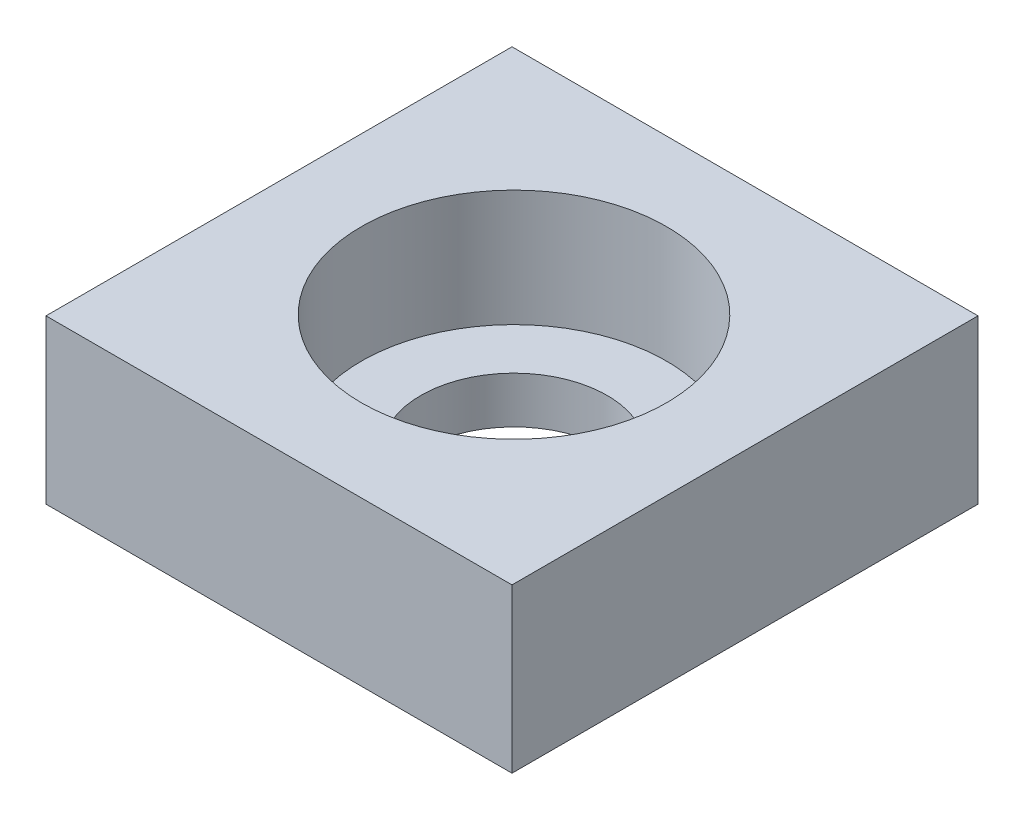
ISO-10303-21;
HEADER;
FILE_DESCRIPTION(('STEP AP214'),'2;1');
FILE_NAME('part.step','',(''),(''),'','','');
FILE_SCHEMA(('AUTOMOTIVE_DESIGN { 1 0 10303 214 1 1 1 1 }'));
ENDSEC;
DATA;
#1=APPLICATION_CONTEXT('core data for automotive mechanical design processes');
#2=APPLICATION_PROTOCOL_DEFINITION('international standard','automotive_design',2000,#1);
#3=PRODUCT_CONTEXT('',#1,'mechanical');
#4=PRODUCT('Part','Part','',(#3));
#5=PRODUCT_RELATED_PRODUCT_CATEGORY('part','',(#4));
#6=PRODUCT_DEFINITION_FORMATION('','',#4);
#7=PRODUCT_DEFINITION_CONTEXT('part definition',#1,'design');
#8=PRODUCT_DEFINITION('design','',#6,#7);
#9=PRODUCT_DEFINITION_SHAPE('','',#8);
#10=(LENGTH_UNIT() NAMED_UNIT(*) SI_UNIT(.MILLI.,.METRE.));
#11=(NAMED_UNIT(*) PLANE_ANGLE_UNIT() SI_UNIT($,.RADIAN.));
#12=(NAMED_UNIT(*) SI_UNIT($,.STERADIAN.) SOLID_ANGLE_UNIT());
#13=UNCERTAINTY_MEASURE_WITH_UNIT(LENGTH_MEASURE(1.E-05),#10,'distance_accuracy_value','');
#14=(GEOMETRIC_REPRESENTATION_CONTEXT(3) GLOBAL_UNCERTAINTY_ASSIGNED_CONTEXT((#13)) GLOBAL_UNIT_ASSIGNED_CONTEXT((#10,
#11,#12)) REPRESENTATION_CONTEXT('',''));
#15=CARTESIAN_POINT('',(0.,0.,0.));
#16=DIRECTION('',(0.,0.,1.));
#17=DIRECTION('',(1.,0.,0.));
#18=AXIS2_PLACEMENT_3D('',#15,#16,#17);
#19=CARTESIAN_POINT('',(0.,7.,0.));
#20=DIRECTION('',(0.,0.,-1.));
#21=DIRECTION('',(-1.,0.,0.));
#22=AXIS2_PLACEMENT_3D('',#19,#20,#21);
#23=PLANE('',#22);
#24=DIRECTION('',(1.,0.,0.));
#25=VECTOR('',#24,1.);
#26=CARTESIAN_POINT('',(0.,0.,0.));
#27=LINE('',#26,#25);
#28=CARTESIAN_POINT('',(0.,0.,0.));
#29=VERTEX_POINT('',#28);
#30=CARTESIAN_POINT('',(20.,0.,0.));
#31=VERTEX_POINT('',#30);
#32=EDGE_CURVE('E96',#29,#31,#27,.T.);
#33=ORIENTED_EDGE('',*,*,#32,.T.);
#34=DIRECTION('',(0.,-1.,0.));
#35=VECTOR('',#34,1.);
#36=CARTESIAN_POINT('',(20.,7.,0.));
#37=LINE('',#36,#35);
#38=CARTESIAN_POINT('',(20.,7.,0.));
#39=VERTEX_POINT('',#38);
#40=EDGE_CURVE('E11',#39,#31,#37,.T.);
#41=ORIENTED_EDGE('',*,*,#40,.F.);
#42=DIRECTION('',(1.,0.,0.));
#43=VECTOR('',#42,1.);
#44=CARTESIAN_POINT('',(0.,7.,0.));
#45=LINE('',#44,#43);
#46=CARTESIAN_POINT('',(0.,7.,0.));
#47=VERTEX_POINT('',#46);
#48=EDGE_CURVE('E82',#47,#39,#45,.T.);
#49=ORIENTED_EDGE('',*,*,#48,.F.);
#50=DIRECTION('',(0.,-1.,0.));
#51=VECTOR('',#50,1.);
#52=CARTESIAN_POINT('',(0.,7.,0.));
#53=LINE('',#52,#51);
#54=EDGE_CURVE('E49',#47,#29,#53,.T.);
#55=ORIENTED_EDGE('',*,*,#54,.T.);
#56=EDGE_LOOP('',(#33,#41,#49,#55));
#57=FACE_BOUND('',#56,.T.);
#58=ADVANCED_FACE('F33',(#57),#23,.F.);
#59=CARTESIAN_POINT('',(20.,7.,0.));
#60=DIRECTION('',(-1.,0.,0.));
#61=DIRECTION('',(0.,0.,1.));
#62=AXIS2_PLACEMENT_3D('',#59,#60,#61);
#63=PLANE('',#62);
#64=DIRECTION('',(0.,0.,-1.));
#65=VECTOR('',#64,1.);
#66=CARTESIAN_POINT('',(20.,0.,0.));
#67=LINE('',#66,#65);
#68=CARTESIAN_POINT('',(20.,0.,-20.));
#69=VERTEX_POINT('',#68);
#70=EDGE_CURVE('E87',#31,#69,#67,.T.);
#71=ORIENTED_EDGE('',*,*,#70,.T.);
#72=DIRECTION('',(0.,-1.,0.));
#73=VECTOR('',#72,1.);
#74=CARTESIAN_POINT('',(20.,7.,-20.));
#75=LINE('',#74,#73);
#76=CARTESIAN_POINT('',(20.,7.,-20.));
#77=VERTEX_POINT('',#76);
#78=EDGE_CURVE('E41',#77,#69,#75,.T.);
#79=ORIENTED_EDGE('',*,*,#78,.F.);
#80=DIRECTION('',(0.,0.,-1.));
#81=VECTOR('',#80,1.);
#82=CARTESIAN_POINT('',(20.,7.,0.));
#83=LINE('',#82,#81);
#84=EDGE_CURVE('E74',#39,#77,#83,.T.);
#85=ORIENTED_EDGE('',*,*,#84,.F.);
#86=ORIENTED_EDGE('',*,*,#40,.T.);
#87=EDGE_LOOP('',(#71,#79,#85,#86));
#88=FACE_BOUND('',#87,.T.);
#89=ADVANCED_FACE('F86',(#88),#63,.F.);
#90=CARTESIAN_POINT('',(0.,7.,-20.));
#91=DIRECTION('',(0.,0.,-1.));
#92=DIRECTION('',(-1.,0.,0.));
#93=AXIS2_PLACEMENT_3D('',#90,#91,#92);
#94=PLANE('',#93);
#95=DIRECTION('',(1.,0.,0.));
#96=VECTOR('',#95,1.);
#97=CARTESIAN_POINT('',(0.,0.,-20.));
#98=LINE('',#97,#96);
#99=CARTESIAN_POINT('',(0.,0.,-20.));
#100=VERTEX_POINT('',#99);
#101=EDGE_CURVE('E100',#100,#69,#98,.T.);
#102=ORIENTED_EDGE('',*,*,#101,.F.);
#103=DIRECTION('',(0.,-1.,0.));
#104=VECTOR('',#103,1.);
#105=CARTESIAN_POINT('',(0.,7.,-20.));
#106=LINE('',#105,#104);
#107=CARTESIAN_POINT('',(0.,7.,-20.));
#108=VERTEX_POINT('',#107);
#109=EDGE_CURVE('E63',#108,#100,#106,.T.);
#110=ORIENTED_EDGE('',*,*,#109,.F.);
#111=DIRECTION('',(1.,0.,0.));
#112=VECTOR('',#111,1.);
#113=CARTESIAN_POINT('',(0.,7.,-20.));
#114=LINE('',#113,#112);
#115=EDGE_CURVE('E81',#108,#77,#114,.T.);
#116=ORIENTED_EDGE('',*,*,#115,.T.);
#117=ORIENTED_EDGE('',*,*,#78,.T.);
#118=EDGE_LOOP('',(#102,#110,#116,#117));
#119=FACE_BOUND('',#118,.T.);
#120=ADVANCED_FACE('F90',(#119),#94,.T.);
#121=CARTESIAN_POINT('',(0.,7.,0.));
#122=DIRECTION('',(-1.,0.,0.));
#123=DIRECTION('',(0.,0.,1.));
#124=AXIS2_PLACEMENT_3D('',#121,#122,#123);
#125=PLANE('',#124);
#126=DIRECTION('',(0.,0.,-1.));
#127=VECTOR('',#126,1.);
#128=CARTESIAN_POINT('',(0.,0.,0.));
#129=LINE('',#128,#127);
#130=EDGE_CURVE('E102',#29,#100,#129,.T.);
#131=ORIENTED_EDGE('',*,*,#130,.F.);
#132=ORIENTED_EDGE('',*,*,#54,.F.);
#133=DIRECTION('',(0.,0.,-1.));
#134=VECTOR('',#133,1.);
#135=CARTESIAN_POINT('',(0.,7.,0.));
#136=LINE('',#135,#134);
#137=EDGE_CURVE('E91',#47,#108,#136,.T.);
#138=ORIENTED_EDGE('',*,*,#137,.T.);
#139=ORIENTED_EDGE('',*,*,#109,.T.);
#140=EDGE_LOOP('',(#131,#132,#138,#139));
#141=FACE_BOUND('',#140,.T.);
#142=ADVANCED_FACE('F136',(#141),#125,.T.);
#143=CARTESIAN_POINT('',(0.,7.,0.));
#144=DIRECTION('',(0.,1.,0.));
#145=DIRECTION('',(0.,0.,1.));
#146=AXIS2_PLACEMENT_3D('',#143,#144,#145);
#147=PLANE('',#146);
#148=CARTESIAN_POINT('',(10.,7.,-10.0851888571187));
#149=DIRECTION('',(0.,1.,0.));
#150=DIRECTION('',(0.,0.,1.));
#151=AXIS2_PLACEMENT_3D('',#148,#149,#150);
#152=CIRCLE('',#151,6.55);
#153=CARTESIAN_POINT('',(10.,7.,-3.5351888571187));
#154=VERTEX_POINT('',#153);
#155=EDGE_CURVE('E108',#154,#154,#152,.T.);
#156=ORIENTED_EDGE('',*,*,#155,.F.);
#157=EDGE_LOOP('',(#156));
#158=FACE_BOUND('',#157,.T.);
#159=ORIENTED_EDGE('',*,*,#48,.T.);
#160=ORIENTED_EDGE('',*,*,#84,.T.);
#161=ORIENTED_EDGE('',*,*,#115,.F.);
#162=ORIENTED_EDGE('',*,*,#137,.F.);
#163=EDGE_LOOP('',(#159,#160,#161,#162));
#164=FACE_BOUND('',#163,.T.);
#165=ADVANCED_FACE('F78',(#158,#164),#147,.T.);
#166=CARTESIAN_POINT('',(0.,0.,0.));
#167=DIRECTION('',(0.,1.,0.));
#168=DIRECTION('',(0.,0.,1.));
#169=AXIS2_PLACEMENT_3D('',#166,#167,#168);
#170=PLANE('',#169);
#171=CARTESIAN_POINT('',(10.,0.,-10.0851888571187));
#172=DIRECTION('',(0.,1.,0.));
#173=DIRECTION('',(0.,0.,1.));
#174=AXIS2_PLACEMENT_3D('',#171,#172,#173);
#175=CIRCLE('',#174,4.);
#176=CARTESIAN_POINT('',(10.,0.,-6.0851888571187));
#177=VERTEX_POINT('',#176);
#178=EDGE_CURVE('E111',#177,#177,#175,.F.);
#179=ORIENTED_EDGE('',*,*,#178,.F.);
#180=EDGE_LOOP('',(#179));
#181=FACE_BOUND('',#180,.T.);
#182=ORIENTED_EDGE('',*,*,#32,.F.);
#183=ORIENTED_EDGE('',*,*,#130,.T.);
#184=ORIENTED_EDGE('',*,*,#101,.T.);
#185=ORIENTED_EDGE('',*,*,#70,.F.);
#186=EDGE_LOOP('',(#182,#183,#184,#185));
#187=FACE_BOUND('',#186,.T.);
#188=ADVANCED_FACE('F131',(#181,#187),#170,.F.);
#189=CARTESIAN_POINT('',(10.,2.,-10.0851888571187));
#190=DIRECTION('',(0.,1.,0.));
#191=DIRECTION('',(0.,0.,1.));
#192=AXIS2_PLACEMENT_3D('',#189,#190,#191);
#193=CYLINDRICAL_SURFACE('',#192,6.55);
#194=CARTESIAN_POINT('',(10.,2.,-10.0851888571187));
#195=DIRECTION('',(0.,1.,0.));
#196=DIRECTION('',(0.,0.,1.));
#197=AXIS2_PLACEMENT_3D('',#194,#195,#196);
#198=CIRCLE('',#197,6.55);
#199=CARTESIAN_POINT('',(10.,2.,-3.5351888571187));
#200=VERTEX_POINT('',#199);
#201=EDGE_CURVE('E98',#200,#200,#198,.T.);
#202=ORIENTED_EDGE('',*,*,#201,.F.);
#203=EDGE_LOOP('',(#202));
#204=FACE_BOUND('',#203,.T.);
#205=ORIENTED_EDGE('',*,*,#155,.T.);
#206=EDGE_LOOP('',(#205));
#207=FACE_BOUND('',#206,.T.);
#208=ADVANCED_FACE('F125',(#204,#207),#193,.F.);
#209=CARTESIAN_POINT('',(10.,2.,-10.0851888571187));
#210=DIRECTION('',(0.,1.,0.));
#211=DIRECTION('',(0.,0.,1.));
#212=AXIS2_PLACEMENT_3D('',#209,#210,#211);
#213=PLANE('',#212);
#214=CARTESIAN_POINT('',(10.,2.,-10.0851888571187));
#215=DIRECTION('',(0.,1.,0.));
#216=DIRECTION('',(0.,0.,1.));
#217=AXIS2_PLACEMENT_3D('',#214,#215,#216);
#218=CIRCLE('',#217,4.);
#219=CARTESIAN_POINT('',(10.,2.,-6.0851888571187));
#220=VERTEX_POINT('',#219);
#221=EDGE_CURVE('E116',#220,#220,#218,.T.);
#222=ORIENTED_EDGE('',*,*,#221,.F.);
#223=EDGE_LOOP('',(#222));
#224=FACE_BOUND('',#223,.T.);
#225=ORIENTED_EDGE('',*,*,#201,.T.);
#226=EDGE_LOOP('',(#225));
#227=FACE_BOUND('',#226,.T.);
#228=ADVANCED_FACE('F122',(#224,#227),#213,.T.);
#229=CARTESIAN_POINT('',(10.,-11.3137084989848,-10.0851888571187));
#230=DIRECTION('',(0.,1.,0.));
#231=DIRECTION('',(0.,0.,1.));
#232=AXIS2_PLACEMENT_3D('',#229,#230,#231);
#233=CYLINDRICAL_SURFACE('',#232,4.);
#234=CARTESIAN_POINT('',(10.,0.,-6.0851888571187));
#235=CARTESIAN_POINT('',(10.,0.0208333333333333,-6.0851888571187));
#236=CARTESIAN_POINT('',(10.,0.0416666666666667,-6.0851888571187));
#237=CARTESIAN_POINT('',(10.,0.0833333333333334,-6.0851888571187));
#238=CARTESIAN_POINT('',(10.,0.104166666666667,-6.0851888571187));
#239=CARTESIAN_POINT('',(10.,0.145833333333333,-6.0851888571187));
#240=CARTESIAN_POINT('',(10.,0.166666666666667,-6.0851888571187));
#241=CARTESIAN_POINT('',(10.,0.208333333333334,-6.0851888571187));
#242=CARTESIAN_POINT('',(10.,0.229166666666667,-6.0851888571187));
#243=CARTESIAN_POINT('',(10.,0.270833333333334,-6.0851888571187));
#244=CARTESIAN_POINT('',(10.,0.291666666666667,-6.0851888571187));
#245=CARTESIAN_POINT('',(10.,0.333333333333334,-6.0851888571187));
#246=CARTESIAN_POINT('',(10.,0.354166666666667,-6.0851888571187));
#247=CARTESIAN_POINT('',(10.,0.395833333333334,-6.0851888571187));
#248=CARTESIAN_POINT('',(10.,0.416666666666667,-6.0851888571187));
#249=CARTESIAN_POINT('',(10.,0.458333333333334,-6.0851888571187));
#250=CARTESIAN_POINT('',(10.,0.479166666666667,-6.0851888571187));
#251=CARTESIAN_POINT('',(10.,0.520833333333333,-6.0851888571187));
#252=CARTESIAN_POINT('',(10.,0.541666666666666,-6.0851888571187));
#253=CARTESIAN_POINT('',(10.,0.583333333333332,-6.0851888571187));
#254=CARTESIAN_POINT('',(10.,0.604166666666666,-6.0851888571187));
#255=CARTESIAN_POINT('',(10.,0.645833333333332,-6.0851888571187));
#256=CARTESIAN_POINT('',(10.,0.666666666666666,-6.0851888571187));
#257=CARTESIAN_POINT('',(10.,0.708333333333332,-6.0851888571187));
#258=CARTESIAN_POINT('',(10.,0.729166666666666,-6.0851888571187));
#259=CARTESIAN_POINT('',(10.,0.770833333333332,-6.0851888571187));
#260=CARTESIAN_POINT('',(10.,0.791666666666666,-6.0851888571187));
#261=CARTESIAN_POINT('',(10.,0.833333333333332,-6.0851888571187));
#262=CARTESIAN_POINT('',(10.,0.854166666666666,-6.0851888571187));
#263=CARTESIAN_POINT('',(10.,0.895833333333332,-6.0851888571187));
#264=CARTESIAN_POINT('',(10.,0.916666666666666,-6.0851888571187));
#265=CARTESIAN_POINT('',(10.,0.958333333333332,-6.0851888571187));
#266=CARTESIAN_POINT('',(10.,0.979166666666666,-6.0851888571187));
#267=CARTESIAN_POINT('',(10.,1.02083333333333,-6.0851888571187));
#268=CARTESIAN_POINT('',(10.,1.04166666666667,-6.0851888571187));
#269=CARTESIAN_POINT('',(10.,1.08333333333333,-6.0851888571187));
#270=CARTESIAN_POINT('',(10.,1.10416666666667,-6.0851888571187));
#271=CARTESIAN_POINT('',(10.,1.14583333333333,-6.0851888571187));
#272=CARTESIAN_POINT('',(10.,1.16666666666667,-6.0851888571187));
#273=CARTESIAN_POINT('',(10.,1.20833333333333,-6.0851888571187));
#274=CARTESIAN_POINT('',(10.,1.22916666666667,-6.0851888571187));
#275=CARTESIAN_POINT('',(10.,1.27083333333333,-6.0851888571187));
#276=CARTESIAN_POINT('',(10.,1.29166666666667,-6.0851888571187));
#277=CARTESIAN_POINT('',(10.,1.33333333333333,-6.0851888571187));
#278=CARTESIAN_POINT('',(10.,1.35416666666667,-6.0851888571187));
#279=CARTESIAN_POINT('',(10.,1.39583333333333,-6.0851888571187));
#280=CARTESIAN_POINT('',(10.,1.41666666666666,-6.0851888571187));
#281=CARTESIAN_POINT('',(10.,1.45833333333333,-6.0851888571187));
#282=CARTESIAN_POINT('',(10.,1.47916666666666,-6.0851888571187));
#283=CARTESIAN_POINT('',(10.,1.52083333333333,-6.0851888571187));
#284=CARTESIAN_POINT('',(10.,1.54166666666666,-6.0851888571187));
#285=CARTESIAN_POINT('',(10.,1.58333333333333,-6.0851888571187));
#286=CARTESIAN_POINT('',(10.,1.60416666666666,-6.0851888571187));
#287=CARTESIAN_POINT('',(10.,1.64583333333333,-6.0851888571187));
#288=CARTESIAN_POINT('',(10.,1.66666666666666,-6.0851888571187));
#289=CARTESIAN_POINT('',(10.,1.70833333333333,-6.0851888571187));
#290=CARTESIAN_POINT('',(10.,1.72916666666666,-6.0851888571187));
#291=CARTESIAN_POINT('',(10.,1.77083333333333,-6.0851888571187));
#292=CARTESIAN_POINT('',(10.,1.79166666666666,-6.0851888571187));
#293=CARTESIAN_POINT('',(10.,1.83333333333333,-6.0851888571187));
#294=CARTESIAN_POINT('',(10.,1.85416666666666,-6.0851888571187));
#295=CARTESIAN_POINT('',(10.,1.89583333333333,-6.0851888571187));
#296=CARTESIAN_POINT('',(10.,1.91666666666666,-6.0851888571187));
#297=CARTESIAN_POINT('',(10.,1.95833333333333,-6.0851888571187));
#298=CARTESIAN_POINT('',(10.,1.97916666666667,-6.0851888571187));
#299=CARTESIAN_POINT('',(10.,2.,-6.0851888571187));
#300=B_SPLINE_CURVE_WITH_KNOTS('',3,(#234,#235,#236,#237,#238,#239,#240,#241,#242,#243,#244,
#245,#246,#247,#248,#249,#250,#251,#252,#253,#254,#255,#256,#257,#258,#259,#260,#261,#262,#263,
#264,#265,#266,#267,#268,#269,#270,#271,#272,#273,#274,#275,#276,#277,#278,#279,#280,#281,#282,
#283,#284,#285,#286,#287,#288,#289,#290,#291,#292,#293,#294,#295,#296,#297,#298,#299),
.UNSPECIFIED.,.F.,.F.,(4,2,2,2,2,2,2,2,2,2,2,2,2,2,2,2,2,2,2,2,2,2,2,2,2,2,2,2,2,2,2,2,4),(0.,
0.0625000000000001,0.125,0.1875,0.25,0.3125,0.375,0.4375,0.5,0.562499999999999,
0.624999999999999,0.687499999999999,0.749999999999999,0.812499999999999,0.874999999999999,
0.937499999999999,0.999999999999999,1.0625,1.125,1.1875,1.25,1.3125,1.375,1.4375,1.5,1.5625,
1.625,1.6875,1.75,1.8125,1.875,1.9375,2.),.UNSPECIFIED.);
#301=EDGE_CURVE('BSEAM120',#177,#220,#300,.T.);
#302=ORIENTED_EDGE('',*,*,#178,.T.);
#303=ORIENTED_EDGE('',*,*,#221,.T.);
#304=ORIENTED_EDGE('',*,*,#301,.T.);
#305=ORIENTED_EDGE('',*,*,#301,.F.);
#306=EDGE_LOOP('',(#302,#304,#303,#305));
#307=FACE_BOUND('',#306,.T.);
#308=ADVANCED_FACE('F120',(#307),#233,.F.);
#309=CLOSED_SHELL('',(#58,#89,#120,#142,#165,#188,#208,#228,#308));
#310=MANIFOLD_SOLID_BREP('B2',#309);
#311=ADVANCED_BREP_SHAPE_REPRESENTATION('',(#18,#310),#14);
#312=SHAPE_DEFINITION_REPRESENTATION(#9,#311);
ENDSEC;
END-ISO-10303-21;
